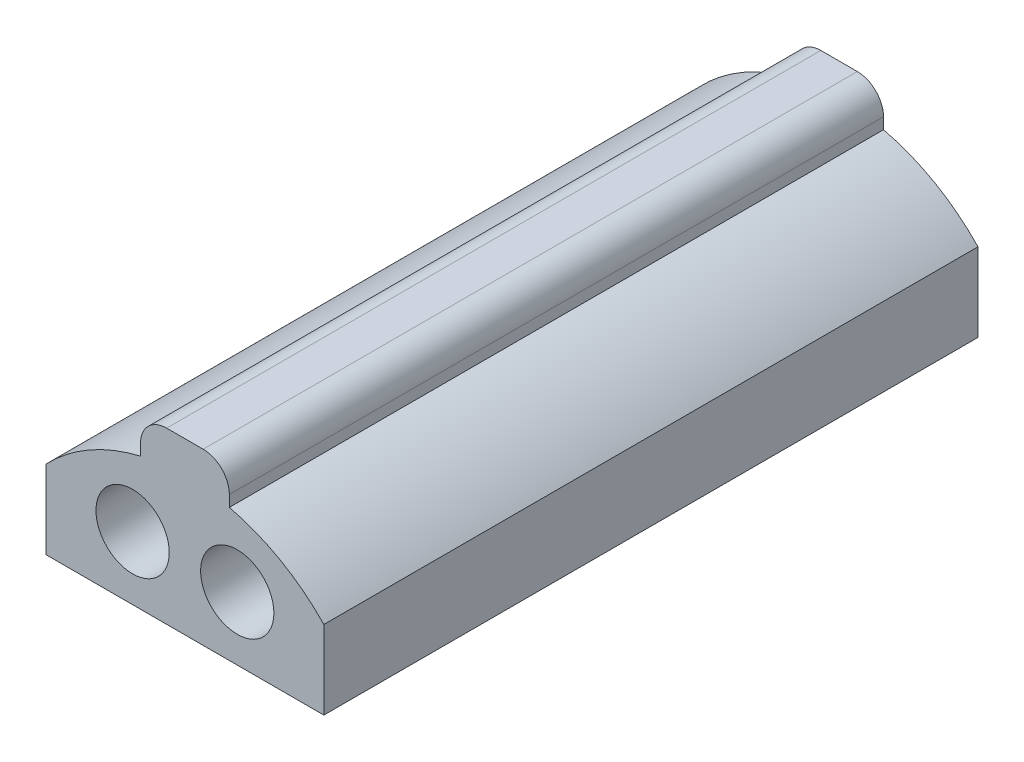
ISO-10303-21;
HEADER;
FILE_DESCRIPTION(('STEP AP214'),'2;1');
FILE_NAME('part.step','',(''),(''),'','','');
FILE_SCHEMA(('AUTOMOTIVE_DESIGN { 1 0 10303 214 1 1 1 1 }'));
ENDSEC;
DATA;
#1=APPLICATION_CONTEXT('core data for automotive mechanical design processes');
#2=APPLICATION_PROTOCOL_DEFINITION('international standard','automotive_design',2000,#1);
#3=PRODUCT_CONTEXT('',#1,'mechanical');
#4=PRODUCT('Part','Part','',(#3));
#5=PRODUCT_RELATED_PRODUCT_CATEGORY('part','',(#4));
#6=PRODUCT_DEFINITION_FORMATION('','',#4);
#7=PRODUCT_DEFINITION_CONTEXT('part definition',#1,'design');
#8=PRODUCT_DEFINITION('design','',#6,#7);
#9=PRODUCT_DEFINITION_SHAPE('','',#8);
#10=(LENGTH_UNIT() NAMED_UNIT(*) SI_UNIT(.MILLI.,.METRE.));
#11=(NAMED_UNIT(*) PLANE_ANGLE_UNIT() SI_UNIT($,.RADIAN.));
#12=(NAMED_UNIT(*) SI_UNIT($,.STERADIAN.) SOLID_ANGLE_UNIT());
#13=UNCERTAINTY_MEASURE_WITH_UNIT(LENGTH_MEASURE(1.E-05),#10,'distance_accuracy_value','');
#14=(GEOMETRIC_REPRESENTATION_CONTEXT(3) GLOBAL_UNCERTAINTY_ASSIGNED_CONTEXT((#13)) GLOBAL_UNIT_ASSIGNED_CONTEXT((#10,
#11,#12)) REPRESENTATION_CONTEXT('',''));
#15=CARTESIAN_POINT('',(0.,0.,0.));
#16=DIRECTION('',(0.,0.,1.));
#17=DIRECTION('',(1.,0.,0.));
#18=AXIS2_PLACEMENT_3D('',#15,#16,#17);
#19=CARTESIAN_POINT('',(-10.6183802907976,6.,-50.));
#20=DIRECTION('',(-1.,0.,0.));
#21=DIRECTION('',(0.,0.,1.));
#22=AXIS2_PLACEMENT_3D('',#19,#20,#21);
#23=PLANE('',#22);
#24=DIRECTION('',(0.,-1.,0.));
#25=VECTOR('',#24,1.);
#26=CARTESIAN_POINT('',(-10.6183802907976,6.,0.));
#27=LINE('',#26,#25);
#28=CARTESIAN_POINT('',(-10.6183802907976,6.,0.));
#29=VERTEX_POINT('',#28);
#30=CARTESIAN_POINT('',(-10.6183802907976,0.,0.));
#31=VERTEX_POINT('',#30);
#32=EDGE_CURVE('E142',#29,#31,#27,.T.);
#33=ORIENTED_EDGE('',*,*,#32,.F.);
#34=DIRECTION('',(0.,0.,1.));
#35=VECTOR('',#34,1.);
#36=CARTESIAN_POINT('',(-10.6183802907976,6.,-50.));
#37=LINE('',#36,#35);
#38=CARTESIAN_POINT('',(-10.6183802907976,6.,-50.));
#39=VERTEX_POINT('',#38);
#40=EDGE_CURVE('E11',#39,#29,#37,.T.);
#41=ORIENTED_EDGE('',*,*,#40,.F.);
#42=DIRECTION('',(0.,-1.,0.));
#43=VECTOR('',#42,1.);
#44=CARTESIAN_POINT('',(-10.6183802907976,6.,-50.));
#45=LINE('',#44,#43);
#46=CARTESIAN_POINT('',(-10.6183802907976,0.,-50.));
#47=VERTEX_POINT('',#46);
#48=EDGE_CURVE('E169',#39,#47,#45,.T.);
#49=ORIENTED_EDGE('',*,*,#48,.T.);
#50=DIRECTION('',(0.,0.,1.));
#51=VECTOR('',#50,1.);
#52=CARTESIAN_POINT('',(-10.6183802907976,0.,-50.));
#53=LINE('',#52,#51);
#54=EDGE_CURVE('E36',#47,#31,#53,.T.);
#55=ORIENTED_EDGE('',*,*,#54,.T.);
#56=EDGE_LOOP('',(#33,#41,#49,#55));
#57=FACE_BOUND('',#56,.T.);
#58=ADVANCED_FACE('F33',(#57),#23,.T.);
#59=CARTESIAN_POINT('',(0.,-4.16562836228034,-50.));
#60=DIRECTION('',(0.,0.,1.));
#61=DIRECTION('',(1.,0.,0.));
#62=AXIS2_PLACEMENT_3D('',#59,#60,#61);
#63=CYLINDRICAL_SURFACE('',#62,14.6999999999999);
#64=CARTESIAN_POINT('',(0.,-4.16562836228034,0.));
#65=DIRECTION('',(0.,0.,1.));
#66=DIRECTION('',(1.,0.,0.));
#67=AXIS2_PLACEMENT_3D('',#64,#65,#66);
#68=CIRCLE('',#67,14.6999999999999);
#69=CARTESIAN_POINT('',(-3.3955775029959,10.136820848297,0.));
#70=VERTEX_POINT('',#69);
#71=EDGE_CURVE('E167',#70,#29,#68,.T.);
#72=ORIENTED_EDGE('',*,*,#71,.F.);
#73=DIRECTION('',(0.,0.,1.));
#74=VECTOR('',#73,1.);
#75=CARTESIAN_POINT('',(-3.3955775029959,10.136820848297,-50.));
#76=LINE('',#75,#74);
#77=CARTESIAN_POINT('',(-3.3955775029959,10.136820848297,-50.));
#78=VERTEX_POINT('',#77);
#79=EDGE_CURVE('E42',#78,#70,#76,.T.);
#80=ORIENTED_EDGE('',*,*,#79,.F.);
#81=CARTESIAN_POINT('',(0.,-4.16562836228034,-50.));
#82=DIRECTION('',(0.,0.,1.));
#83=DIRECTION('',(1.,0.,0.));
#84=AXIS2_PLACEMENT_3D('',#81,#82,#83);
#85=CIRCLE('',#84,14.6999999999999);
#86=EDGE_CURVE('E132',#78,#39,#85,.T.);
#87=ORIENTED_EDGE('',*,*,#86,.T.);
#88=ORIENTED_EDGE('',*,*,#40,.T.);
#89=EDGE_LOOP('',(#72,#80,#87,#88));
#90=FACE_BOUND('',#89,.T.);
#91=ADVANCED_FACE('F185',(#90),#63,.T.);
#92=CARTESIAN_POINT('',(-3.3955775029959,10.989327512821,-50.));
#93=DIRECTION('',(-1.,0.,0.));
#94=DIRECTION('',(0.,0.,1.));
#95=AXIS2_PLACEMENT_3D('',#92,#93,#94);
#96=PLANE('',#95);
#97=DIRECTION('',(0.,-1.,0.));
#98=VECTOR('',#97,1.);
#99=CARTESIAN_POINT('',(-3.3955775029959,10.989327512821,0.));
#100=LINE('',#99,#98);
#101=CARTESIAN_POINT('',(-3.3955775029959,10.989327512821,0.));
#102=VERTEX_POINT('',#101);
#103=EDGE_CURVE('E119',#102,#70,#100,.T.);
#104=ORIENTED_EDGE('',*,*,#103,.F.);
#105=DIRECTION('',(0.,0.,1.));
#106=VECTOR('',#105,1.);
#107=CARTESIAN_POINT('',(-3.3955775029959,10.989327512821,-50.));
#108=LINE('',#107,#106);
#109=CARTESIAN_POINT('',(-3.3955775029959,10.989327512821,-50.));
#110=VERTEX_POINT('',#109);
#111=EDGE_CURVE('E114',#110,#102,#108,.T.);
#112=ORIENTED_EDGE('',*,*,#111,.F.);
#113=DIRECTION('',(0.,-1.,0.));
#114=VECTOR('',#113,1.);
#115=CARTESIAN_POINT('',(-3.3955775029959,10.989327512821,-50.));
#116=LINE('',#115,#114);
#117=EDGE_CURVE('E117',#110,#78,#116,.T.);
#118=ORIENTED_EDGE('',*,*,#117,.T.);
#119=ORIENTED_EDGE('',*,*,#79,.T.);
#120=EDGE_LOOP('',(#104,#112,#118,#119));
#121=FACE_BOUND('',#120,.T.);
#122=ADVANCED_FACE('F116',(#121),#96,.T.);
#123=CARTESIAN_POINT('',(-1.3955775029959,10.9893275128211,-50.));
#124=DIRECTION('',(0.,0.,1.));
#125=DIRECTION('',(1.,0.,0.));
#126=AXIS2_PLACEMENT_3D('',#123,#124,#125);
#127=CYLINDRICAL_SURFACE('',#126,2.);
#128=CARTESIAN_POINT('',(-1.3955775029959,10.9893275128211,0.));
#129=DIRECTION('',(0.,0.,1.));
#130=DIRECTION('',(1.,0.,0.));
#131=AXIS2_PLACEMENT_3D('',#128,#129,#130);
#132=CIRCLE('',#131,2.);
#133=CARTESIAN_POINT('',(-1.39557750299589,12.9893275128211,0.));
#134=VERTEX_POINT('',#133);
#135=EDGE_CURVE('E164',#134,#102,#132,.T.);
#136=ORIENTED_EDGE('',*,*,#135,.F.);
#137=DIRECTION('',(0.,0.,1.));
#138=VECTOR('',#137,1.);
#139=CARTESIAN_POINT('',(-1.39557750299589,12.9893275128211,-50.));
#140=LINE('',#139,#138);
#141=CARTESIAN_POINT('',(-1.39557750299589,12.9893275128211,-50.));
#142=VERTEX_POINT('',#141);
#143=EDGE_CURVE('E124',#142,#134,#140,.T.);
#144=ORIENTED_EDGE('',*,*,#143,.F.);
#145=CARTESIAN_POINT('',(-1.3955775029959,10.9893275128211,-50.));
#146=DIRECTION('',(0.,0.,1.));
#147=DIRECTION('',(1.,0.,0.));
#148=AXIS2_PLACEMENT_3D('',#145,#146,#147);
#149=CIRCLE('',#148,2.);
#150=EDGE_CURVE('E130',#142,#110,#149,.T.);
#151=ORIENTED_EDGE('',*,*,#150,.T.);
#152=ORIENTED_EDGE('',*,*,#111,.T.);
#153=EDGE_LOOP('',(#136,#144,#151,#152));
#154=FACE_BOUND('',#153,.T.);
#155=ADVANCED_FACE('F134',(#154),#127,.T.);
#156=CARTESIAN_POINT('',(1.39557750299603,12.9893275128211,-50.));
#157=DIRECTION('',(0.,1.,0.));
#158=DIRECTION('',(-1.,0.,0.));
#159=AXIS2_PLACEMENT_3D('',#156,#157,#158);
#160=PLANE('',#159);
#161=DIRECTION('',(-1.,0.,0.));
#162=VECTOR('',#161,1.);
#163=CARTESIAN_POINT('',(1.39557750299603,12.9893275128211,0.));
#164=LINE('',#163,#162);
#165=CARTESIAN_POINT('',(1.39557750299603,12.9893275128211,0.));
#166=VERTEX_POINT('',#165);
#167=EDGE_CURVE('E161',#166,#134,#164,.T.);
#168=ORIENTED_EDGE('',*,*,#167,.F.);
#169=DIRECTION('',(0.,0.,1.));
#170=VECTOR('',#169,1.);
#171=CARTESIAN_POINT('',(1.39557750299603,12.9893275128211,-50.));
#172=LINE('',#171,#170);
#173=CARTESIAN_POINT('',(1.39557750299603,12.9893275128211,-50.));
#174=VERTEX_POINT('',#173);
#175=EDGE_CURVE('E173',#174,#166,#172,.T.);
#176=ORIENTED_EDGE('',*,*,#175,.F.);
#177=DIRECTION('',(-1.,0.,0.));
#178=VECTOR('',#177,1.);
#179=CARTESIAN_POINT('',(1.39557750299603,12.9893275128211,-50.));
#180=LINE('',#179,#178);
#181=EDGE_CURVE('E135',#174,#142,#180,.T.);
#182=ORIENTED_EDGE('',*,*,#181,.T.);
#183=ORIENTED_EDGE('',*,*,#143,.T.);
#184=EDGE_LOOP('',(#168,#176,#182,#183));
#185=FACE_BOUND('',#184,.T.);
#186=ADVANCED_FACE('F198',(#185),#160,.T.);
#187=CARTESIAN_POINT('',(1.39557750299604,10.9893275128211,-50.));
#188=DIRECTION('',(0.,0.,1.));
#189=DIRECTION('',(1.,0.,0.));
#190=AXIS2_PLACEMENT_3D('',#187,#188,#189);
#191=CYLINDRICAL_SURFACE('',#190,2.);
#192=CARTESIAN_POINT('',(1.39557750299604,10.9893275128211,0.));
#193=DIRECTION('',(0.,0.,1.));
#194=DIRECTION('',(-1.,0.,0.));
#195=AXIS2_PLACEMENT_3D('',#192,#193,#194);
#196=CIRCLE('',#195,2.);
#197=CARTESIAN_POINT('',(3.39557750299604,10.989327512821,0.));
#198=VERTEX_POINT('',#197);
#199=EDGE_CURVE('E158',#198,#166,#196,.T.);
#200=ORIENTED_EDGE('',*,*,#199,.F.);
#201=DIRECTION('',(0.,0.,1.));
#202=VECTOR('',#201,1.);
#203=CARTESIAN_POINT('',(3.39557750299604,10.989327512821,-50.));
#204=LINE('',#203,#202);
#205=CARTESIAN_POINT('',(3.39557750299604,10.989327512821,-50.));
#206=VERTEX_POINT('',#205);
#207=EDGE_CURVE('E175',#206,#198,#204,.T.);
#208=ORIENTED_EDGE('',*,*,#207,.F.);
#209=CARTESIAN_POINT('',(1.39557750299604,10.9893275128211,-50.));
#210=DIRECTION('',(0.,0.,1.));
#211=DIRECTION('',(-1.,0.,0.));
#212=AXIS2_PLACEMENT_3D('',#209,#210,#211);
#213=CIRCLE('',#212,2.);
#214=EDGE_CURVE('E137',#206,#174,#213,.T.);
#215=ORIENTED_EDGE('',*,*,#214,.T.);
#216=ORIENTED_EDGE('',*,*,#175,.T.);
#217=EDGE_LOOP('',(#200,#208,#215,#216));
#218=FACE_BOUND('',#217,.T.);
#219=ADVANCED_FACE('F201',(#218),#191,.T.);
#220=CARTESIAN_POINT('',(3.39557750299604,10.136820848297,-50.));
#221=DIRECTION('',(1.,0.,0.));
#222=DIRECTION('',(0.,0.,-1.));
#223=AXIS2_PLACEMENT_3D('',#220,#221,#222);
#224=PLANE('',#223);
#225=DIRECTION('',(0.,1.,0.));
#226=VECTOR('',#225,1.);
#227=CARTESIAN_POINT('',(3.39557750299604,10.136820848297,0.));
#228=LINE('',#227,#226);
#229=CARTESIAN_POINT('',(3.39557750299604,10.136820848297,0.));
#230=VERTEX_POINT('',#229);
#231=EDGE_CURVE('E155',#230,#198,#228,.T.);
#232=ORIENTED_EDGE('',*,*,#231,.F.);
#233=DIRECTION('',(0.,0.,1.));
#234=VECTOR('',#233,1.);
#235=CARTESIAN_POINT('',(3.39557750299604,10.136820848297,-50.));
#236=LINE('',#235,#234);
#237=CARTESIAN_POINT('',(3.39557750299604,10.136820848297,-50.));
#238=VERTEX_POINT('',#237);
#239=EDGE_CURVE('E177',#238,#230,#236,.T.);
#240=ORIENTED_EDGE('',*,*,#239,.F.);
#241=DIRECTION('',(0.,1.,0.));
#242=VECTOR('',#241,1.);
#243=CARTESIAN_POINT('',(3.39557750299604,10.136820848297,-50.));
#244=LINE('',#243,#242);
#245=EDGE_CURVE('E261',#238,#206,#244,.T.);
#246=ORIENTED_EDGE('',*,*,#245,.T.);
#247=ORIENTED_EDGE('',*,*,#207,.T.);
#248=EDGE_LOOP('',(#232,#240,#246,#247));
#249=FACE_BOUND('',#248,.T.);
#250=ADVANCED_FACE('F205',(#249),#224,.T.);
#251=CARTESIAN_POINT('',(0.,-4.16562836228034,-50.));
#252=DIRECTION('',(0.,0.,1.));
#253=DIRECTION('',(1.,0.,0.));
#254=AXIS2_PLACEMENT_3D('',#251,#252,#253);
#255=CYLINDRICAL_SURFACE('',#254,14.7);
#256=CARTESIAN_POINT('',(0.,-4.16562836228034,0.));
#257=DIRECTION('',(0.,0.,1.));
#258=DIRECTION('',(1.,0.,0.));
#259=AXIS2_PLACEMENT_3D('',#256,#257,#258);
#260=CIRCLE('',#259,14.7);
#261=CARTESIAN_POINT('',(10.6183802907976,6.00000000000001,0.));
#262=VERTEX_POINT('',#261);
#263=EDGE_CURVE('E152',#262,#230,#260,.T.);
#264=ORIENTED_EDGE('',*,*,#263,.F.);
#265=DIRECTION('',(0.,0.,1.));
#266=VECTOR('',#265,1.);
#267=CARTESIAN_POINT('',(10.6183802907976,6.00000000000001,-50.));
#268=LINE('',#267,#266);
#269=CARTESIAN_POINT('',(10.6183802907976,6.00000000000001,-50.));
#270=VERTEX_POINT('',#269);
#271=EDGE_CURVE('E179',#270,#262,#268,.T.);
#272=ORIENTED_EDGE('',*,*,#271,.F.);
#273=CARTESIAN_POINT('',(0.,-4.16562836228034,-50.));
#274=DIRECTION('',(0.,0.,1.));
#275=DIRECTION('',(1.,0.,0.));
#276=AXIS2_PLACEMENT_3D('',#273,#274,#275);
#277=CIRCLE('',#276,14.7);
#278=EDGE_CURVE('E258',#270,#238,#277,.T.);
#279=ORIENTED_EDGE('',*,*,#278,.T.);
#280=ORIENTED_EDGE('',*,*,#239,.T.);
#281=EDGE_LOOP('',(#264,#272,#279,#280));
#282=FACE_BOUND('',#281,.T.);
#283=ADVANCED_FACE('F209',(#282),#255,.T.);
#284=CARTESIAN_POINT('',(10.6183802907976,0.,-50.));
#285=DIRECTION('',(1.,0.,0.));
#286=DIRECTION('',(0.,1.,0.));
#287=AXIS2_PLACEMENT_3D('',#284,#285,#286);
#288=PLANE('',#287);
#289=DIRECTION('',(0.,1.,0.));
#290=VECTOR('',#289,1.);
#291=CARTESIAN_POINT('',(10.6183802907976,0.,0.));
#292=LINE('',#291,#290);
#293=CARTESIAN_POINT('',(10.6183802907976,0.,0.));
#294=VERTEX_POINT('',#293);
#295=EDGE_CURVE('E149',#294,#262,#292,.T.);
#296=ORIENTED_EDGE('',*,*,#295,.F.);
#297=DIRECTION('',(0.,0.,1.));
#298=VECTOR('',#297,1.);
#299=CARTESIAN_POINT('',(10.6183802907976,0.,-50.));
#300=LINE('',#299,#298);
#301=CARTESIAN_POINT('',(10.6183802907976,0.,-50.));
#302=VERTEX_POINT('',#301);
#303=EDGE_CURVE('E180',#302,#294,#300,.T.);
#304=ORIENTED_EDGE('',*,*,#303,.F.);
#305=DIRECTION('',(0.,1.,0.));
#306=VECTOR('',#305,1.);
#307=CARTESIAN_POINT('',(10.6183802907976,0.,-50.));
#308=LINE('',#307,#306);
#309=EDGE_CURVE('E255',#302,#270,#308,.T.);
#310=ORIENTED_EDGE('',*,*,#309,.T.);
#311=ORIENTED_EDGE('',*,*,#271,.T.);
#312=EDGE_LOOP('',(#296,#304,#310,#311));
#313=FACE_BOUND('',#312,.T.);
#314=ADVANCED_FACE('F213',(#313),#288,.T.);
#315=CARTESIAN_POINT('',(-10.6183802907976,0.,-50.));
#316=DIRECTION('',(0.,-1.,0.));
#317=DIRECTION('',(1.,0.,0.));
#318=AXIS2_PLACEMENT_3D('',#315,#316,#317);
#319=PLANE('',#318);
#320=DIRECTION('',(1.,0.,0.));
#321=VECTOR('',#320,1.);
#322=CARTESIAN_POINT('',(-10.6183802907976,0.,0.));
#323=LINE('',#322,#321);
#324=EDGE_CURVE('E145',#31,#294,#323,.T.);
#325=ORIENTED_EDGE('',*,*,#324,.F.);
#326=ORIENTED_EDGE('',*,*,#54,.F.);
#327=DIRECTION('',(1.,0.,0.));
#328=VECTOR('',#327,1.);
#329=CARTESIAN_POINT('',(-10.6183802907976,0.,-50.));
#330=LINE('',#329,#328);
#331=EDGE_CURVE('E253',#47,#302,#330,.T.);
#332=ORIENTED_EDGE('',*,*,#331,.T.);
#333=ORIENTED_EDGE('',*,*,#303,.T.);
#334=EDGE_LOOP('',(#325,#326,#332,#333));
#335=FACE_BOUND('',#334,.T.);
#336=ADVANCED_FACE('F182',(#335),#319,.T.);
#337=CARTESIAN_POINT('',(0.,-4.16562836228034,-50.));
#338=DIRECTION('',(0.,0.,1.));
#339=DIRECTION('',(1.,0.,0.));
#340=AXIS2_PLACEMENT_3D('',#337,#338,#339);
#341=PLANE('',#340);
#342=CARTESIAN_POINT('',(-4.,4.84,-50.));
#343=DIRECTION('',(0.,0.,1.));
#344=DIRECTION('',(1.,0.,0.));
#345=AXIS2_PLACEMENT_3D('',#342,#343,#344);
#346=CIRCLE('',#345,2.8);
#347=CARTESIAN_POINT('',(-1.2,4.84,-50.));
#348=VERTEX_POINT('',#347);
#349=EDGE_CURVE('E146',#348,#348,#346,.T.);
#350=ORIENTED_EDGE('',*,*,#349,.T.);
#351=EDGE_LOOP('',(#350));
#352=FACE_BOUND('',#351,.T.);
#353=CARTESIAN_POINT('',(4.,4.84,-50.));
#354=DIRECTION('',(0.,0.,1.));
#355=DIRECTION('',(1.,0.,0.));
#356=AXIS2_PLACEMENT_3D('',#353,#354,#355);
#357=CIRCLE('',#356,2.8);
#358=CARTESIAN_POINT('',(6.8,4.84,-50.));
#359=VERTEX_POINT('',#358);
#360=EDGE_CURVE('E243',#359,#359,#357,.T.);
#361=ORIENTED_EDGE('',*,*,#360,.T.);
#362=EDGE_LOOP('',(#361));
#363=FACE_BOUND('',#362,.T.);
#364=ORIENTED_EDGE('',*,*,#48,.F.);
#365=ORIENTED_EDGE('',*,*,#86,.F.);
#366=ORIENTED_EDGE('',*,*,#117,.F.);
#367=ORIENTED_EDGE('',*,*,#150,.F.);
#368=ORIENTED_EDGE('',*,*,#181,.F.);
#369=ORIENTED_EDGE('',*,*,#214,.F.);
#370=ORIENTED_EDGE('',*,*,#245,.F.);
#371=ORIENTED_EDGE('',*,*,#278,.F.);
#372=ORIENTED_EDGE('',*,*,#309,.F.);
#373=ORIENTED_EDGE('',*,*,#331,.F.);
#374=EDGE_LOOP('',(#364,#365,#366,#367,#368,#369,#370,#371,#372,#373));
#375=FACE_BOUND('',#374,.T.);
#376=ADVANCED_FACE('F128',(#352,#363,#375),#341,.F.);
#377=CARTESIAN_POINT('',(0.,-4.16562836228034,0.));
#378=DIRECTION('',(0.,0.,1.));
#379=DIRECTION('',(1.,0.,0.));
#380=AXIS2_PLACEMENT_3D('',#377,#378,#379);
#381=PLANE('',#380);
#382=CARTESIAN_POINT('',(-4.,4.84,0.));
#383=DIRECTION('',(0.,0.,1.));
#384=DIRECTION('',(1.,0.,0.));
#385=AXIS2_PLACEMENT_3D('',#382,#383,#384);
#386=CIRCLE('',#385,2.8);
#387=CARTESIAN_POINT('',(-1.2,4.84,0.));
#388=VERTEX_POINT('',#387);
#389=EDGE_CURVE('E242',#388,#388,#386,.T.);
#390=ORIENTED_EDGE('',*,*,#389,.F.);
#391=EDGE_LOOP('',(#390));
#392=FACE_BOUND('',#391,.T.);
#393=CARTESIAN_POINT('',(4.,4.84,0.));
#394=DIRECTION('',(0.,0.,1.));
#395=DIRECTION('',(1.,0.,0.));
#396=AXIS2_PLACEMENT_3D('',#393,#394,#395);
#397=CIRCLE('',#396,2.8);
#398=CARTESIAN_POINT('',(6.8,4.84,0.));
#399=VERTEX_POINT('',#398);
#400=EDGE_CURVE('E247',#399,#399,#397,.T.);
#401=ORIENTED_EDGE('',*,*,#400,.F.);
#402=EDGE_LOOP('',(#401));
#403=FACE_BOUND('',#402,.T.);
#404=ORIENTED_EDGE('',*,*,#32,.T.);
#405=ORIENTED_EDGE('',*,*,#324,.T.);
#406=ORIENTED_EDGE('',*,*,#295,.T.);
#407=ORIENTED_EDGE('',*,*,#263,.T.);
#408=ORIENTED_EDGE('',*,*,#231,.T.);
#409=ORIENTED_EDGE('',*,*,#199,.T.);
#410=ORIENTED_EDGE('',*,*,#167,.T.);
#411=ORIENTED_EDGE('',*,*,#135,.T.);
#412=ORIENTED_EDGE('',*,*,#103,.T.);
#413=ORIENTED_EDGE('',*,*,#71,.T.);
#414=EDGE_LOOP('',(#404,#405,#406,#407,#408,#409,#410,#411,#412,#413));
#415=FACE_BOUND('',#414,.T.);
#416=ADVANCED_FACE('F184',(#392,#403,#415),#381,.T.);
#417=CARTESIAN_POINT('',(4.,4.84,-50.));
#418=DIRECTION('',(0.,0.,1.));
#419=DIRECTION('',(1.,0.,0.));
#420=AXIS2_PLACEMENT_3D('',#417,#418,#419);
#421=CYLINDRICAL_SURFACE('',#420,2.8);
#422=ORIENTED_EDGE('',*,*,#360,.F.);
#423=EDGE_LOOP('',(#422));
#424=FACE_BOUND('',#423,.T.);
#425=ORIENTED_EDGE('',*,*,#400,.T.);
#426=EDGE_LOOP('',(#425));
#427=FACE_BOUND('',#426,.T.);
#428=ADVANCED_FACE('F225',(#424,#427),#421,.F.);
#429=CARTESIAN_POINT('',(-4.,4.84,-50.));
#430=DIRECTION('',(0.,0.,1.));
#431=DIRECTION('',(1.,0.,0.));
#432=AXIS2_PLACEMENT_3D('',#429,#430,#431);
#433=CYLINDRICAL_SURFACE('',#432,2.8);
#434=ORIENTED_EDGE('',*,*,#349,.F.);
#435=EDGE_LOOP('',(#434));
#436=FACE_BOUND('',#435,.T.);
#437=ORIENTED_EDGE('',*,*,#389,.T.);
#438=EDGE_LOOP('',(#437));
#439=FACE_BOUND('',#438,.T.);
#440=ADVANCED_FACE('F232',(#436,#439),#433,.F.);
#441=CLOSED_SHELL('',(#58,#91,#122,#155,#186,#219,#250,#283,#314,#336,#376,#416,#428,#440));
#442=MANIFOLD_SOLID_BREP('B2',#441);
#443=ADVANCED_BREP_SHAPE_REPRESENTATION('',(#18,#442),#14);
#444=SHAPE_DEFINITION_REPRESENTATION(#9,#443);
ENDSEC;
END-ISO-10303-21;
